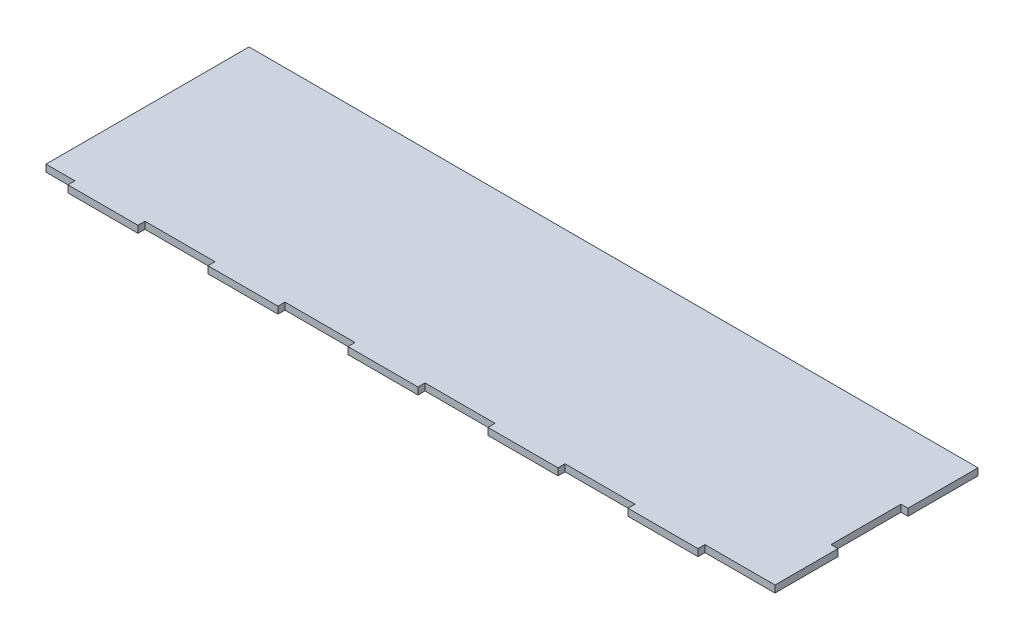
ISO-10303-21;
HEADER;
FILE_DESCRIPTION(('STEP AP214'),'2;1');
FILE_NAME('part.step','',(''),(''),'','','');
FILE_SCHEMA(('AUTOMOTIVE_DESIGN { 1 0 10303 214 1 1 1 1 }'));
ENDSEC;
DATA;
#1=APPLICATION_CONTEXT('core data for automotive mechanical design processes');
#2=APPLICATION_PROTOCOL_DEFINITION('international standard','automotive_design',2000,#1);
#3=PRODUCT_CONTEXT('',#1,'mechanical');
#4=PRODUCT('Part','Part','',(#3));
#5=PRODUCT_RELATED_PRODUCT_CATEGORY('part','',(#4));
#6=PRODUCT_DEFINITION_FORMATION('','',#4);
#7=PRODUCT_DEFINITION_CONTEXT('part definition',#1,'design');
#8=PRODUCT_DEFINITION('design','',#6,#7);
#9=PRODUCT_DEFINITION_SHAPE('','',#8);
#10=(LENGTH_UNIT() NAMED_UNIT(*) SI_UNIT(.MILLI.,.METRE.));
#11=(NAMED_UNIT(*) PLANE_ANGLE_UNIT() SI_UNIT($,.RADIAN.));
#12=(NAMED_UNIT(*) SI_UNIT($,.STERADIAN.) SOLID_ANGLE_UNIT());
#13=UNCERTAINTY_MEASURE_WITH_UNIT(LENGTH_MEASURE(1.E-05),#10,'distance_accuracy_value','');
#14=(GEOMETRIC_REPRESENTATION_CONTEXT(3) GLOBAL_UNCERTAINTY_ASSIGNED_CONTEXT((#13)) GLOBAL_UNIT_ASSIGNED_CONTEXT((#10,
#11,#12)) REPRESENTATION_CONTEXT('',''));
#15=CARTESIAN_POINT('',(0.,0.,0.));
#16=DIRECTION('',(0.,0.,1.));
#17=DIRECTION('',(1.,0.,0.));
#18=AXIS2_PLACEMENT_3D('',#15,#16,#17);
#19=CARTESIAN_POINT('',(2.60000000000005,0.,0.));
#20=DIRECTION('',(-1.,0.,0.));
#21=DIRECTION('',(0.,0.,1.));
#22=AXIS2_PLACEMENT_3D('',#19,#20,#21);
#23=PLANE('',#22);
#24=DIRECTION('',(0.,0.,-1.));
#25=VECTOR('',#24,1.);
#26=CARTESIAN_POINT('',(2.60000000000005,3.,0.));
#27=LINE('',#26,#25);
#28=CARTESIAN_POINT('',(2.60000000000005,3.,42.));
#29=VERTEX_POINT('',#28);
#30=CARTESIAN_POINT('',(2.60000000000005,3.,-45.));
#31=VERTEX_POINT('',#30);
#32=EDGE_CURVE('E238',#29,#31,#27,.T.);
#33=ORIENTED_EDGE('',*,*,#32,.T.);
#34=DIRECTION('',(0.,-1.,0.));
#35=VECTOR('',#34,1.);
#36=CARTESIAN_POINT('',(2.60000000000005,3.,-45.));
#37=LINE('',#36,#35);
#38=CARTESIAN_POINT('',(2.60000000000005,0.,-45.));
#39=VERTEX_POINT('',#38);
#40=EDGE_CURVE('E54',#31,#39,#37,.T.);
#41=ORIENTED_EDGE('',*,*,#40,.T.);
#42=DIRECTION('',(0.,0.,-1.));
#43=VECTOR('',#42,1.);
#44=CARTESIAN_POINT('',(2.60000000000005,0.,0.));
#45=LINE('',#44,#43);
#46=CARTESIAN_POINT('',(2.60000000000005,0.,42.));
#47=VERTEX_POINT('',#46);
#48=EDGE_CURVE('E62',#47,#39,#45,.T.);
#49=ORIENTED_EDGE('',*,*,#48,.F.);
#50=DIRECTION('',(0.,1.,0.));
#51=VECTOR('',#50,1.);
#52=CARTESIAN_POINT('',(2.60000000000005,0.,42.));
#53=LINE('',#52,#51);
#54=EDGE_CURVE('E12',#47,#29,#53,.T.);
#55=ORIENTED_EDGE('',*,*,#54,.T.);
#56=EDGE_LOOP('',(#33,#41,#49,#55));
#57=FACE_BOUND('',#56,.T.);
#58=ADVANCED_FACE('F39',(#57),#23,.T.);
#59=CARTESIAN_POINT('',(-315.,3.,-45.));
#60=DIRECTION('',(0.,0.,1.));
#61=DIRECTION('',(1.,0.,0.));
#62=AXIS2_PLACEMENT_3D('',#59,#60,#61);
#63=PLANE('',#62);
#64=ORIENTED_EDGE('',*,*,#40,.F.);
#65=DIRECTION('',(-1.,0.,0.));
#66=VECTOR('',#65,1.);
#67=CARTESIAN_POINT('',(-315.,3.,-45.));
#68=LINE('',#67,#66);
#69=CARTESIAN_POINT('',(315.,3.,-45.));
#70=VERTEX_POINT('',#69);
#71=EDGE_CURVE('E240',#70,#31,#68,.T.);
#72=ORIENTED_EDGE('',*,*,#71,.F.);
#73=DIRECTION('',(0.,-1.,0.));
#74=VECTOR('',#73,1.);
#75=CARTESIAN_POINT('',(315.,3.,-45.));
#76=LINE('',#75,#74);
#77=CARTESIAN_POINT('',(315.,0.,-45.));
#78=VERTEX_POINT('',#77);
#79=EDGE_CURVE('E414',#70,#78,#76,.T.);
#80=ORIENTED_EDGE('',*,*,#79,.T.);
#81=DIRECTION('',(-1.,0.,0.));
#82=VECTOR('',#81,1.);
#83=CARTESIAN_POINT('',(-315.,0.,-45.));
#84=LINE('',#83,#82);
#85=EDGE_CURVE('E407',#78,#39,#84,.T.);
#86=ORIENTED_EDGE('',*,*,#85,.T.);
#87=EDGE_LOOP('',(#64,#72,#80,#86));
#88=FACE_BOUND('',#87,.T.);
#89=ADVANCED_FACE('F488',(#88),#63,.F.);
#90=CARTESIAN_POINT('',(0.,3.,0.));
#91=DIRECTION('',(0.,-1.,0.));
#92=DIRECTION('',(0.,0.,-1.));
#93=AXIS2_PLACEMENT_3D('',#90,#91,#92);
#94=PLANE('',#93);
#95=ORIENTED_EDGE('',*,*,#32,.F.);
#96=DIRECTION('',(-1.,0.,0.));
#97=VECTOR('',#96,1.);
#98=CARTESIAN_POINT('',(-15.,3.,42.));
#99=LINE('',#98,#97);
#100=CARTESIAN_POINT('',(15.,3.,42.));
#101=VERTEX_POINT('',#100);
#102=EDGE_CURVE('E226',#101,#29,#99,.T.);
#103=ORIENTED_EDGE('',*,*,#102,.F.);
#104=DIRECTION('',(0.,0.,-1.));
#105=VECTOR('',#104,1.);
#106=CARTESIAN_POINT('',(15.,3.,45.));
#107=LINE('',#106,#105);
#108=CARTESIAN_POINT('',(15.,3.,45.));
#109=VERTEX_POINT('',#108);
#110=EDGE_CURVE('E235',#109,#101,#107,.T.);
#111=ORIENTED_EDGE('',*,*,#110,.F.);
#112=DIRECTION('',(1.,0.,0.));
#113=VECTOR('',#112,1.);
#114=CARTESIAN_POINT('',(-315.,3.,45.));
#115=LINE('',#114,#113);
#116=CARTESIAN_POINT('',(45.,3.,45.));
#117=VERTEX_POINT('',#116);
#118=EDGE_CURVE('E403',#109,#117,#115,.T.);
#119=ORIENTED_EDGE('',*,*,#118,.T.);
#120=DIRECTION('',(0.,0.,1.));
#121=VECTOR('',#120,1.);
#122=CARTESIAN_POINT('',(45.,3.,45.));
#123=LINE('',#122,#121);
#124=CARTESIAN_POINT('',(45.,3.,42.));
#125=VERTEX_POINT('',#124);
#126=EDGE_CURVE('E285',#125,#117,#123,.T.);
#127=ORIENTED_EDGE('',*,*,#126,.F.);
#128=DIRECTION('',(-1.,0.,0.));
#129=VECTOR('',#128,1.);
#130=CARTESIAN_POINT('',(45.,3.,42.));
#131=LINE('',#130,#129);
#132=CARTESIAN_POINT('',(75.,3.,42.));
#133=VERTEX_POINT('',#132);
#134=EDGE_CURVE('E278',#133,#125,#131,.T.);
#135=ORIENTED_EDGE('',*,*,#134,.F.);
#136=DIRECTION('',(0.,0.,-1.));
#137=VECTOR('',#136,1.);
#138=CARTESIAN_POINT('',(75.,3.,45.));
#139=LINE('',#138,#137);
#140=CARTESIAN_POINT('',(75.,3.,45.));
#141=VERTEX_POINT('',#140);
#142=EDGE_CURVE('E287',#141,#133,#139,.T.);
#143=ORIENTED_EDGE('',*,*,#142,.F.);
#144=CARTESIAN_POINT('',(105.,3.,45.));
#145=VERTEX_POINT('',#144);
#146=EDGE_CURVE('E754',#141,#145,#115,.T.);
#147=ORIENTED_EDGE('',*,*,#146,.T.);
#148=DIRECTION('',(0.,0.,1.));
#149=VECTOR('',#148,1.);
#150=CARTESIAN_POINT('',(105.,3.,45.));
#151=LINE('',#150,#149);
#152=CARTESIAN_POINT('',(105.,3.,42.));
#153=VERTEX_POINT('',#152);
#154=EDGE_CURVE('E311',#153,#145,#151,.T.);
#155=ORIENTED_EDGE('',*,*,#154,.F.);
#156=DIRECTION('',(-1.,0.,0.));
#157=VECTOR('',#156,1.);
#158=CARTESIAN_POINT('',(105.,3.,42.));
#159=LINE('',#158,#157);
#160=CARTESIAN_POINT('',(135.,3.,42.));
#161=VERTEX_POINT('',#160);
#162=EDGE_CURVE('E304',#161,#153,#159,.T.);
#163=ORIENTED_EDGE('',*,*,#162,.F.);
#164=DIRECTION('',(0.,0.,-1.));
#165=VECTOR('',#164,1.);
#166=CARTESIAN_POINT('',(135.,3.,45.));
#167=LINE('',#166,#165);
#168=CARTESIAN_POINT('',(135.,3.,45.));
#169=VERTEX_POINT('',#168);
#170=EDGE_CURVE('E313',#169,#161,#167,.T.);
#171=ORIENTED_EDGE('',*,*,#170,.F.);
#172=CARTESIAN_POINT('',(165.,3.,45.));
#173=VERTEX_POINT('',#172);
#174=EDGE_CURVE('E751',#169,#173,#115,.T.);
#175=ORIENTED_EDGE('',*,*,#174,.T.);
#176=DIRECTION('',(0.,0.,1.));
#177=VECTOR('',#176,1.);
#178=CARTESIAN_POINT('',(165.,3.,45.));
#179=LINE('',#178,#177);
#180=CARTESIAN_POINT('',(165.,3.,42.));
#181=VERTEX_POINT('',#180);
#182=EDGE_CURVE('E337',#181,#173,#179,.T.);
#183=ORIENTED_EDGE('',*,*,#182,.F.);
#184=DIRECTION('',(-1.,0.,0.));
#185=VECTOR('',#184,1.);
#186=CARTESIAN_POINT('',(165.,3.,42.));
#187=LINE('',#186,#185);
#188=CARTESIAN_POINT('',(195.,3.,42.));
#189=VERTEX_POINT('',#188);
#190=EDGE_CURVE('E330',#189,#181,#187,.T.);
#191=ORIENTED_EDGE('',*,*,#190,.F.);
#192=DIRECTION('',(0.,0.,-1.));
#193=VECTOR('',#192,1.);
#194=CARTESIAN_POINT('',(195.,3.,45.));
#195=LINE('',#194,#193);
#196=CARTESIAN_POINT('',(195.,3.,45.));
#197=VERTEX_POINT('',#196);
#198=EDGE_CURVE('E339',#197,#189,#195,.T.);
#199=ORIENTED_EDGE('',*,*,#198,.F.);
#200=CARTESIAN_POINT('',(225.,3.,45.));
#201=VERTEX_POINT('',#200);
#202=EDGE_CURVE('E402',#197,#201,#115,.T.);
#203=ORIENTED_EDGE('',*,*,#202,.T.);
#204=DIRECTION('',(0.,0.,1.));
#205=VECTOR('',#204,1.);
#206=CARTESIAN_POINT('',(225.,3.,45.));
#207=LINE('',#206,#205);
#208=CARTESIAN_POINT('',(225.,3.,42.));
#209=VERTEX_POINT('',#208);
#210=EDGE_CURVE('E363',#209,#201,#207,.T.);
#211=ORIENTED_EDGE('',*,*,#210,.F.);
#212=DIRECTION('',(-1.,0.,0.));
#213=VECTOR('',#212,1.);
#214=CARTESIAN_POINT('',(225.,3.,42.));
#215=LINE('',#214,#213);
#216=CARTESIAN_POINT('',(255.,3.,42.));
#217=VERTEX_POINT('',#216);
#218=EDGE_CURVE('E356',#217,#209,#215,.T.);
#219=ORIENTED_EDGE('',*,*,#218,.F.);
#220=DIRECTION('',(0.,0.,-1.));
#221=VECTOR('',#220,1.);
#222=CARTESIAN_POINT('',(255.,3.,45.));
#223=LINE('',#222,#221);
#224=CARTESIAN_POINT('',(255.,3.,45.));
#225=VERTEX_POINT('',#224);
#226=EDGE_CURVE('E365',#225,#217,#223,.T.);
#227=ORIENTED_EDGE('',*,*,#226,.F.);
#228=CARTESIAN_POINT('',(285.,3.,45.));
#229=VERTEX_POINT('',#228);
#230=EDGE_CURVE('E399',#225,#229,#115,.T.);
#231=ORIENTED_EDGE('',*,*,#230,.T.);
#232=DIRECTION('',(0.,0.,1.));
#233=VECTOR('',#232,1.);
#234=CARTESIAN_POINT('',(285.,3.,45.));
#235=LINE('',#234,#233);
#236=CARTESIAN_POINT('',(285.,3.,42.));
#237=VERTEX_POINT('',#236);
#238=EDGE_CURVE('E261',#237,#229,#235,.T.);
#239=ORIENTED_EDGE('',*,*,#238,.F.);
#240=DIRECTION('',(-1.,0.,0.));
#241=VECTOR('',#240,1.);
#242=CARTESIAN_POINT('',(285.,3.,42.));
#243=LINE('',#242,#241);
#244=CARTESIAN_POINT('',(315.,3.,42.));
#245=VERTEX_POINT('',#244);
#246=EDGE_CURVE('E382',#245,#237,#243,.T.);
#247=ORIENTED_EDGE('',*,*,#246,.F.);
#248=DIRECTION('',(0.,0.,-1.));
#249=VECTOR('',#248,1.);
#250=CARTESIAN_POINT('',(315.,3.,45.));
#251=LINE('',#250,#249);
#252=CARTESIAN_POINT('',(315.,3.,14.9999999985429));
#253=VERTEX_POINT('',#252);
#254=EDGE_CURVE('E394',#245,#253,#251,.T.);
#255=ORIENTED_EDGE('',*,*,#254,.T.);
#256=DIRECTION('',(-1.,0.,0.));
#257=VECTOR('',#256,1.);
#258=CARTESIAN_POINT('',(312.,3.,14.9999999985429));
#259=LINE('',#258,#257);
#260=CARTESIAN_POINT('',(312.,3.,14.9999999985429));
#261=VERTEX_POINT('',#260);
#262=EDGE_CURVE('E247',#253,#261,#259,.T.);
#263=ORIENTED_EDGE('',*,*,#262,.T.);
#264=DIRECTION('',(0.,0.,-1.));
#265=VECTOR('',#264,1.);
#266=CARTESIAN_POINT('',(312.,3.,14.9999999985429));
#267=LINE('',#266,#265);
#268=CARTESIAN_POINT('',(312.,3.,-15.0000000014571));
#269=VERTEX_POINT('',#268);
#270=EDGE_CURVE('E250',#261,#269,#267,.T.);
#271=ORIENTED_EDGE('',*,*,#270,.T.);
#272=DIRECTION('',(1.,0.,0.));
#273=VECTOR('',#272,1.);
#274=CARTESIAN_POINT('',(312.,3.,-15.0000000014571));
#275=LINE('',#274,#273);
#276=CARTESIAN_POINT('',(315.,3.,-15.0000000014571));
#277=VERTEX_POINT('',#276);
#278=EDGE_CURVE('E253',#269,#277,#275,.T.);
#279=ORIENTED_EDGE('',*,*,#278,.T.);
#280=EDGE_CURVE('E397',#277,#70,#251,.T.);
#281=ORIENTED_EDGE('',*,*,#280,.T.);
#282=ORIENTED_EDGE('',*,*,#71,.T.);
#283=EDGE_LOOP('',(#95,#103,#111,#119,#127,#135,#143,#147,#155,#163,#171,#175,#183,#191,#199,
#203,#211,#219,#227,#231,#239,#247,#255,#263,#271,#279,#281,#282));
#284=FACE_BOUND('',#283,.T.);
#285=ADVANCED_FACE('F239',(#284),#94,.F.);
#286=CARTESIAN_POINT('',(0.,0.,0.));
#287=DIRECTION('',(0.,-1.,0.));
#288=DIRECTION('',(0.,0.,-1.));
#289=AXIS2_PLACEMENT_3D('',#286,#287,#288);
#290=PLANE('',#289);
#291=DIRECTION('',(-1.,0.,0.));
#292=VECTOR('',#291,1.);
#293=CARTESIAN_POINT('',(-15.,0.,42.));
#294=LINE('',#293,#292);
#295=CARTESIAN_POINT('',(15.,0.,42.));
#296=VERTEX_POINT('',#295);
#297=EDGE_CURVE('E266',#296,#47,#294,.T.);
#298=ORIENTED_EDGE('',*,*,#297,.T.);
#299=ORIENTED_EDGE('',*,*,#48,.T.);
#300=ORIENTED_EDGE('',*,*,#85,.F.);
#301=DIRECTION('',(0.,0.,-1.));
#302=VECTOR('',#301,1.);
#303=CARTESIAN_POINT('',(315.,0.,45.));
#304=LINE('',#303,#302);
#305=CARTESIAN_POINT('',(315.,0.,-15.0000000014571));
#306=VERTEX_POINT('',#305);
#307=EDGE_CURVE('E272',#306,#78,#304,.T.);
#308=ORIENTED_EDGE('',*,*,#307,.F.);
#309=DIRECTION('',(1.,0.,0.));
#310=VECTOR('',#309,1.);
#311=CARTESIAN_POINT('',(0.,0.,-15.0000000014569));
#312=LINE('',#311,#310);
#313=CARTESIAN_POINT('',(312.,0.,-15.0000000014571));
#314=VERTEX_POINT('',#313);
#315=EDGE_CURVE('E47',#314,#306,#312,.T.);
#316=ORIENTED_EDGE('',*,*,#315,.F.);
#317=DIRECTION('',(0.,0.,-1.));
#318=VECTOR('',#317,1.);
#319=CARTESIAN_POINT('',(312.,0.,0.));
#320=LINE('',#319,#318);
#321=CARTESIAN_POINT('',(312.,0.,14.9999999985429));
#322=VERTEX_POINT('',#321);
#323=EDGE_CURVE('E420',#322,#314,#320,.T.);
#324=ORIENTED_EDGE('',*,*,#323,.F.);
#325=DIRECTION('',(-1.,0.,0.));
#326=VECTOR('',#325,1.);
#327=CARTESIAN_POINT('',(0.,0.,14.9999999985429));
#328=LINE('',#327,#326);
#329=CARTESIAN_POINT('',(315.,0.,14.9999999985429));
#330=VERTEX_POINT('',#329);
#331=EDGE_CURVE('E417',#330,#322,#328,.T.);
#332=ORIENTED_EDGE('',*,*,#331,.F.);
#333=CARTESIAN_POINT('',(315.,0.,42.));
#334=VERTEX_POINT('',#333);
#335=EDGE_CURVE('E404',#334,#330,#304,.T.);
#336=ORIENTED_EDGE('',*,*,#335,.F.);
#337=DIRECTION('',(-1.,0.,0.));
#338=VECTOR('',#337,1.);
#339=CARTESIAN_POINT('',(285.,0.,42.));
#340=LINE('',#339,#338);
#341=CARTESIAN_POINT('',(285.,0.,42.));
#342=VERTEX_POINT('',#341);
#343=EDGE_CURVE('E381',#334,#342,#340,.T.);
#344=ORIENTED_EDGE('',*,*,#343,.T.);
#345=DIRECTION('',(0.,0.,1.));
#346=VECTOR('',#345,1.);
#347=CARTESIAN_POINT('',(285.,0.,45.));
#348=LINE('',#347,#346);
#349=CARTESIAN_POINT('',(285.,0.,45.));
#350=VERTEX_POINT('',#349);
#351=EDGE_CURVE('E378',#342,#350,#348,.T.);
#352=ORIENTED_EDGE('',*,*,#351,.T.);
#353=DIRECTION('',(1.,0.,0.));
#354=VECTOR('',#353,1.);
#355=CARTESIAN_POINT('',(-315.,0.,45.));
#356=LINE('',#355,#354);
#357=CARTESIAN_POINT('',(255.,0.,45.));
#358=VERTEX_POINT('',#357);
#359=EDGE_CURVE('E409',#358,#350,#356,.T.);
#360=ORIENTED_EDGE('',*,*,#359,.F.);
#361=DIRECTION('',(0.,0.,-1.));
#362=VECTOR('',#361,1.);
#363=CARTESIAN_POINT('',(255.,0.,45.));
#364=LINE('',#363,#362);
#365=CARTESIAN_POINT('',(255.,0.,42.));
#366=VERTEX_POINT('',#365);
#367=EDGE_CURVE('E355',#358,#366,#364,.T.);
#368=ORIENTED_EDGE('',*,*,#367,.T.);
#369=DIRECTION('',(-1.,0.,0.));
#370=VECTOR('',#369,1.);
#371=CARTESIAN_POINT('',(225.,0.,42.));
#372=LINE('',#371,#370);
#373=CARTESIAN_POINT('',(225.,0.,42.));
#374=VERTEX_POINT('',#373);
#375=EDGE_CURVE('E359',#366,#374,#372,.T.);
#376=ORIENTED_EDGE('',*,*,#375,.T.);
#377=DIRECTION('',(0.,0.,1.));
#378=VECTOR('',#377,1.);
#379=CARTESIAN_POINT('',(225.,0.,45.));
#380=LINE('',#379,#378);
#381=CARTESIAN_POINT('',(225.,0.,45.));
#382=VERTEX_POINT('',#381);
#383=EDGE_CURVE('E352',#374,#382,#380,.T.);
#384=ORIENTED_EDGE('',*,*,#383,.T.);
#385=CARTESIAN_POINT('',(195.,0.,45.));
#386=VERTEX_POINT('',#385);
#387=EDGE_CURVE('E412',#386,#382,#356,.T.);
#388=ORIENTED_EDGE('',*,*,#387,.F.);
#389=DIRECTION('',(0.,0.,-1.));
#390=VECTOR('',#389,1.);
#391=CARTESIAN_POINT('',(195.,0.,45.));
#392=LINE('',#391,#390);
#393=CARTESIAN_POINT('',(195.,0.,42.));
#394=VERTEX_POINT('',#393);
#395=EDGE_CURVE('E329',#386,#394,#392,.T.);
#396=ORIENTED_EDGE('',*,*,#395,.T.);
#397=DIRECTION('',(-1.,0.,0.));
#398=VECTOR('',#397,1.);
#399=CARTESIAN_POINT('',(165.,0.,42.));
#400=LINE('',#399,#398);
#401=CARTESIAN_POINT('',(165.,0.,42.));
#402=VERTEX_POINT('',#401);
#403=EDGE_CURVE('E333',#394,#402,#400,.T.);
#404=ORIENTED_EDGE('',*,*,#403,.T.);
#405=DIRECTION('',(0.,0.,1.));
#406=VECTOR('',#405,1.);
#407=CARTESIAN_POINT('',(165.,0.,45.));
#408=LINE('',#407,#406);
#409=CARTESIAN_POINT('',(165.,0.,45.));
#410=VERTEX_POINT('',#409);
#411=EDGE_CURVE('E326',#402,#410,#408,.T.);
#412=ORIENTED_EDGE('',*,*,#411,.T.);
#413=CARTESIAN_POINT('',(135.,0.,45.));
#414=VERTEX_POINT('',#413);
#415=EDGE_CURVE('E471',#414,#410,#356,.T.);
#416=ORIENTED_EDGE('',*,*,#415,.F.);
#417=DIRECTION('',(0.,0.,-1.));
#418=VECTOR('',#417,1.);
#419=CARTESIAN_POINT('',(135.,0.,45.));
#420=LINE('',#419,#418);
#421=CARTESIAN_POINT('',(135.,0.,42.));
#422=VERTEX_POINT('',#421);
#423=EDGE_CURVE('E303',#414,#422,#420,.T.);
#424=ORIENTED_EDGE('',*,*,#423,.T.);
#425=DIRECTION('',(-1.,0.,0.));
#426=VECTOR('',#425,1.);
#427=CARTESIAN_POINT('',(105.,0.,42.));
#428=LINE('',#427,#426);
#429=CARTESIAN_POINT('',(105.,0.,42.));
#430=VERTEX_POINT('',#429);
#431=EDGE_CURVE('E307',#422,#430,#428,.T.);
#432=ORIENTED_EDGE('',*,*,#431,.T.);
#433=DIRECTION('',(0.,0.,1.));
#434=VECTOR('',#433,1.);
#435=CARTESIAN_POINT('',(105.,0.,45.));
#436=LINE('',#435,#434);
#437=CARTESIAN_POINT('',(105.,0.,45.));
#438=VERTEX_POINT('',#437);
#439=EDGE_CURVE('E300',#430,#438,#436,.T.);
#440=ORIENTED_EDGE('',*,*,#439,.T.);
#441=CARTESIAN_POINT('',(75.,0.,45.));
#442=VERTEX_POINT('',#441);
#443=EDGE_CURVE('E473',#442,#438,#356,.T.);
#444=ORIENTED_EDGE('',*,*,#443,.F.);
#445=DIRECTION('',(0.,0.,-1.));
#446=VECTOR('',#445,1.);
#447=CARTESIAN_POINT('',(75.,0.,45.));
#448=LINE('',#447,#446);
#449=CARTESIAN_POINT('',(75.,0.,42.));
#450=VERTEX_POINT('',#449);
#451=EDGE_CURVE('E277',#442,#450,#448,.T.);
#452=ORIENTED_EDGE('',*,*,#451,.T.);
#453=DIRECTION('',(-1.,0.,0.));
#454=VECTOR('',#453,1.);
#455=CARTESIAN_POINT('',(45.,0.,42.));
#456=LINE('',#455,#454);
#457=CARTESIAN_POINT('',(45.,0.,42.));
#458=VERTEX_POINT('',#457);
#459=EDGE_CURVE('E281',#450,#458,#456,.T.);
#460=ORIENTED_EDGE('',*,*,#459,.T.);
#461=DIRECTION('',(0.,0.,1.));
#462=VECTOR('',#461,1.);
#463=CARTESIAN_POINT('',(45.,0.,45.));
#464=LINE('',#463,#462);
#465=CARTESIAN_POINT('',(45.,0.,45.));
#466=VERTEX_POINT('',#465);
#467=EDGE_CURVE('E274',#458,#466,#464,.T.);
#468=ORIENTED_EDGE('',*,*,#467,.T.);
#469=CARTESIAN_POINT('',(15.,0.,45.));
#470=VERTEX_POINT('',#469);
#471=EDGE_CURVE('E413',#470,#466,#356,.T.);
#472=ORIENTED_EDGE('',*,*,#471,.F.);
#473=DIRECTION('',(0.,0.,-1.));
#474=VECTOR('',#473,1.);
#475=CARTESIAN_POINT('',(15.,0.,45.));
#476=LINE('',#475,#474);
#477=EDGE_CURVE('E234',#470,#296,#476,.T.);
#478=ORIENTED_EDGE('',*,*,#477,.T.);
#479=EDGE_LOOP('',(#298,#299,#300,#308,#316,#324,#332,#336,#344,#352,#360,#368,#376,#384,#388,
#396,#404,#412,#416,#424,#432,#440,#444,#452,#460,#468,#472,#478));
#480=FACE_BOUND('',#479,.T.);
#481=ADVANCED_FACE('F429',(#480),#290,.T.);
#482=CARTESIAN_POINT('',(-15.,0.,42.));
#483=DIRECTION('',(0.,0.,-1.));
#484=DIRECTION('',(-1.,0.,0.));
#485=AXIS2_PLACEMENT_3D('',#482,#483,#484);
#486=PLANE('',#485);
#487=ORIENTED_EDGE('',*,*,#54,.F.);
#488=ORIENTED_EDGE('',*,*,#297,.F.);
#489=DIRECTION('',(0.,1.,0.));
#490=VECTOR('',#489,1.);
#491=CARTESIAN_POINT('',(15.,0.,42.));
#492=LINE('',#491,#490);
#493=EDGE_CURVE('E230',#296,#101,#492,.T.);
#494=ORIENTED_EDGE('',*,*,#493,.T.);
#495=ORIENTED_EDGE('',*,*,#102,.T.);
#496=EDGE_LOOP('',(#487,#488,#494,#495));
#497=FACE_BOUND('',#496,.T.);
#498=ADVANCED_FACE('F228',(#497),#486,.F.);
#499=CARTESIAN_POINT('',(315.,3.,45.));
#500=DIRECTION('',(-1.,0.,0.));
#501=DIRECTION('',(0.,0.,1.));
#502=AXIS2_PLACEMENT_3D('',#499,#500,#501);
#503=PLANE('',#502);
#504=ORIENTED_EDGE('',*,*,#280,.F.);
#505=DIRECTION('',(0.,-1.,0.));
#506=VECTOR('',#505,1.);
#507=CARTESIAN_POINT('',(315.,3.,-15.0000000014571));
#508=LINE('',#507,#506);
#509=EDGE_CURVE('E255',#277,#306,#508,.T.);
#510=ORIENTED_EDGE('',*,*,#509,.T.);
#511=ORIENTED_EDGE('',*,*,#307,.T.);
#512=ORIENTED_EDGE('',*,*,#79,.F.);
#513=EDGE_LOOP('',(#504,#510,#511,#512));
#514=FACE_BOUND('',#513,.T.);
#515=ADVANCED_FACE('F489',(#514),#503,.F.);
#516=CARTESIAN_POINT('',(-315.,3.,45.));
#517=DIRECTION('',(0.,0.,-1.));
#518=DIRECTION('',(-1.,0.,0.));
#519=AXIS2_PLACEMENT_3D('',#516,#517,#518);
#520=PLANE('',#519);
#521=ORIENTED_EDGE('',*,*,#387,.T.);
#522=DIRECTION('',(0.,1.,0.));
#523=VECTOR('',#522,1.);
#524=CARTESIAN_POINT('',(225.,0.,45.));
#525=LINE('',#524,#523);
#526=EDGE_CURVE('E362',#382,#201,#525,.T.);
#527=ORIENTED_EDGE('',*,*,#526,.T.);
#528=ORIENTED_EDGE('',*,*,#202,.F.);
#529=DIRECTION('',(0.,1.,0.));
#530=VECTOR('',#529,1.);
#531=CARTESIAN_POINT('',(195.,0.,45.));
#532=LINE('',#531,#530);
#533=EDGE_CURVE('E348',#386,#197,#532,.T.);
#534=ORIENTED_EDGE('',*,*,#533,.F.);
#535=EDGE_LOOP('',(#521,#527,#528,#534));
#536=FACE_BOUND('',#535,.T.);
#537=ADVANCED_FACE('F468',(#536),#520,.F.);
#538=ORIENTED_EDGE('',*,*,#415,.T.);
#539=DIRECTION('',(0.,1.,0.));
#540=VECTOR('',#539,1.);
#541=CARTESIAN_POINT('',(165.,0.,45.));
#542=LINE('',#541,#540);
#543=EDGE_CURVE('E336',#410,#173,#542,.T.);
#544=ORIENTED_EDGE('',*,*,#543,.T.);
#545=ORIENTED_EDGE('',*,*,#174,.F.);
#546=DIRECTION('',(0.,1.,0.));
#547=VECTOR('',#546,1.);
#548=CARTESIAN_POINT('',(135.,0.,45.));
#549=LINE('',#548,#547);
#550=EDGE_CURVE('E322',#414,#169,#549,.T.);
#551=ORIENTED_EDGE('',*,*,#550,.F.);
#552=EDGE_LOOP('',(#538,#544,#545,#551));
#553=FACE_BOUND('',#552,.T.);
#554=ADVANCED_FACE('F495',(#553),#520,.F.);
#555=ORIENTED_EDGE('',*,*,#443,.T.);
#556=DIRECTION('',(0.,1.,0.));
#557=VECTOR('',#556,1.);
#558=CARTESIAN_POINT('',(105.,0.,45.));
#559=LINE('',#558,#557);
#560=EDGE_CURVE('E310',#438,#145,#559,.T.);
#561=ORIENTED_EDGE('',*,*,#560,.T.);
#562=ORIENTED_EDGE('',*,*,#146,.F.);
#563=DIRECTION('',(0.,1.,0.));
#564=VECTOR('',#563,1.);
#565=CARTESIAN_POINT('',(75.,0.,45.));
#566=LINE('',#565,#564);
#567=EDGE_CURVE('E296',#442,#141,#566,.T.);
#568=ORIENTED_EDGE('',*,*,#567,.F.);
#569=EDGE_LOOP('',(#555,#561,#562,#568));
#570=FACE_BOUND('',#569,.T.);
#571=ADVANCED_FACE('F569',(#570),#520,.F.);
#572=ORIENTED_EDGE('',*,*,#471,.T.);
#573=DIRECTION('',(0.,1.,0.));
#574=VECTOR('',#573,1.);
#575=CARTESIAN_POINT('',(45.,0.,45.));
#576=LINE('',#575,#574);
#577=EDGE_CURVE('E284',#466,#117,#576,.T.);
#578=ORIENTED_EDGE('',*,*,#577,.T.);
#579=ORIENTED_EDGE('',*,*,#118,.F.);
#580=DIRECTION('',(0.,1.,0.));
#581=VECTOR('',#580,1.);
#582=CARTESIAN_POINT('',(15.,0.,45.));
#583=LINE('',#582,#581);
#584=EDGE_CURVE('E268',#470,#109,#583,.T.);
#585=ORIENTED_EDGE('',*,*,#584,.F.);
#586=EDGE_LOOP('',(#572,#578,#579,#585));
#587=FACE_BOUND('',#586,.T.);
#588=ADVANCED_FACE('F499',(#587),#520,.F.);
#589=ORIENTED_EDGE('',*,*,#335,.T.);
#590=DIRECTION('',(0.,-1.,0.));
#591=VECTOR('',#590,1.);
#592=CARTESIAN_POINT('',(315.,3.,14.9999999985429));
#593=LINE('',#592,#591);
#594=EDGE_CURVE('E246',#253,#330,#593,.T.);
#595=ORIENTED_EDGE('',*,*,#594,.F.);
#596=ORIENTED_EDGE('',*,*,#254,.F.);
#597=DIRECTION('',(0.,1.,0.));
#598=VECTOR('',#597,1.);
#599=CARTESIAN_POINT('',(315.,0.,42.));
#600=LINE('',#599,#598);
#601=EDGE_CURVE('E390',#334,#245,#600,.T.);
#602=ORIENTED_EDGE('',*,*,#601,.F.);
#603=EDGE_LOOP('',(#589,#595,#596,#602));
#604=FACE_BOUND('',#603,.T.);
#605=ADVANCED_FACE('F41',(#604),#503,.F.);
#606=ORIENTED_EDGE('',*,*,#359,.T.);
#607=DIRECTION('',(0.,1.,0.));
#608=VECTOR('',#607,1.);
#609=CARTESIAN_POINT('',(285.,0.,45.));
#610=LINE('',#609,#608);
#611=EDGE_CURVE('E385',#350,#229,#610,.T.);
#612=ORIENTED_EDGE('',*,*,#611,.T.);
#613=ORIENTED_EDGE('',*,*,#230,.F.);
#614=DIRECTION('',(0.,1.,0.));
#615=VECTOR('',#614,1.);
#616=CARTESIAN_POINT('',(255.,0.,45.));
#617=LINE('',#616,#615);
#618=EDGE_CURVE('E374',#358,#225,#617,.T.);
#619=ORIENTED_EDGE('',*,*,#618,.F.);
#620=EDGE_LOOP('',(#606,#612,#613,#619));
#621=FACE_BOUND('',#620,.T.);
#622=ADVANCED_FACE('F451',(#621),#520,.F.);
#623=CARTESIAN_POINT('',(15.,0.,45.));
#624=DIRECTION('',(1.,0.,0.));
#625=DIRECTION('',(0.,0.,-1.));
#626=AXIS2_PLACEMENT_3D('',#623,#624,#625);
#627=PLANE('',#626);
#628=ORIENTED_EDGE('',*,*,#110,.T.);
#629=ORIENTED_EDGE('',*,*,#493,.F.);
#630=ORIENTED_EDGE('',*,*,#477,.F.);
#631=ORIENTED_EDGE('',*,*,#584,.T.);
#632=EDGE_LOOP('',(#628,#629,#630,#631));
#633=FACE_BOUND('',#632,.T.);
#634=ADVANCED_FACE('F512',(#633),#627,.F.);
#635=CARTESIAN_POINT('',(45.,0.,45.));
#636=DIRECTION('',(-1.,0.,0.));
#637=DIRECTION('',(0.,0.,1.));
#638=AXIS2_PLACEMENT_3D('',#635,#636,#637);
#639=PLANE('',#638);
#640=ORIENTED_EDGE('',*,*,#126,.T.);
#641=ORIENTED_EDGE('',*,*,#577,.F.);
#642=ORIENTED_EDGE('',*,*,#467,.F.);
#643=DIRECTION('',(0.,1.,0.));
#644=VECTOR('',#643,1.);
#645=CARTESIAN_POINT('',(45.,0.,42.));
#646=LINE('',#645,#644);
#647=EDGE_CURVE('E269',#458,#125,#646,.T.);
#648=ORIENTED_EDGE('',*,*,#647,.T.);
#649=EDGE_LOOP('',(#640,#641,#642,#648));
#650=FACE_BOUND('',#649,.T.);
#651=ADVANCED_FACE('F515',(#650),#639,.F.);
#652=CARTESIAN_POINT('',(45.,0.,42.));
#653=DIRECTION('',(0.,0.,-1.));
#654=DIRECTION('',(-1.,0.,0.));
#655=AXIS2_PLACEMENT_3D('',#652,#653,#654);
#656=PLANE('',#655);
#657=ORIENTED_EDGE('',*,*,#134,.T.);
#658=ORIENTED_EDGE('',*,*,#647,.F.);
#659=ORIENTED_EDGE('',*,*,#459,.F.);
#660=DIRECTION('',(0.,1.,0.));
#661=VECTOR('',#660,1.);
#662=CARTESIAN_POINT('',(75.,0.,42.));
#663=LINE('',#662,#661);
#664=EDGE_CURVE('E294',#450,#133,#663,.T.);
#665=ORIENTED_EDGE('',*,*,#664,.T.);
#666=EDGE_LOOP('',(#657,#658,#659,#665));
#667=FACE_BOUND('',#666,.T.);
#668=ADVANCED_FACE('F517',(#667),#656,.F.);
#669=CARTESIAN_POINT('',(75.,0.,45.));
#670=DIRECTION('',(1.,0.,0.));
#671=DIRECTION('',(0.,0.,-1.));
#672=AXIS2_PLACEMENT_3D('',#669,#670,#671);
#673=PLANE('',#672);
#674=ORIENTED_EDGE('',*,*,#142,.T.);
#675=ORIENTED_EDGE('',*,*,#664,.F.);
#676=ORIENTED_EDGE('',*,*,#451,.F.);
#677=ORIENTED_EDGE('',*,*,#567,.T.);
#678=EDGE_LOOP('',(#674,#675,#676,#677));
#679=FACE_BOUND('',#678,.T.);
#680=ADVANCED_FACE('F520',(#679),#673,.F.);
#681=CARTESIAN_POINT('',(105.,0.,45.));
#682=DIRECTION('',(-1.,0.,0.));
#683=DIRECTION('',(0.,0.,1.));
#684=AXIS2_PLACEMENT_3D('',#681,#682,#683);
#685=PLANE('',#684);
#686=ORIENTED_EDGE('',*,*,#154,.T.);
#687=ORIENTED_EDGE('',*,*,#560,.F.);
#688=ORIENTED_EDGE('',*,*,#439,.F.);
#689=DIRECTION('',(0.,1.,0.));
#690=VECTOR('',#689,1.);
#691=CARTESIAN_POINT('',(105.,0.,42.));
#692=LINE('',#691,#690);
#693=EDGE_CURVE('E288',#430,#153,#692,.T.);
#694=ORIENTED_EDGE('',*,*,#693,.T.);
#695=EDGE_LOOP('',(#686,#687,#688,#694));
#696=FACE_BOUND('',#695,.T.);
#697=ADVANCED_FACE('F524',(#696),#685,.F.);
#698=CARTESIAN_POINT('',(105.,0.,42.));
#699=DIRECTION('',(0.,0.,-1.));
#700=DIRECTION('',(-1.,0.,0.));
#701=AXIS2_PLACEMENT_3D('',#698,#699,#700);
#702=PLANE('',#701);
#703=ORIENTED_EDGE('',*,*,#162,.T.);
#704=ORIENTED_EDGE('',*,*,#693,.F.);
#705=ORIENTED_EDGE('',*,*,#431,.F.);
#706=DIRECTION('',(0.,1.,0.));
#707=VECTOR('',#706,1.);
#708=CARTESIAN_POINT('',(135.,0.,42.));
#709=LINE('',#708,#707);
#710=EDGE_CURVE('E320',#422,#161,#709,.T.);
#711=ORIENTED_EDGE('',*,*,#710,.T.);
#712=EDGE_LOOP('',(#703,#704,#705,#711));
#713=FACE_BOUND('',#712,.T.);
#714=ADVANCED_FACE('F529',(#713),#702,.F.);
#715=CARTESIAN_POINT('',(135.,0.,45.));
#716=DIRECTION('',(1.,0.,0.));
#717=DIRECTION('',(0.,0.,-1.));
#718=AXIS2_PLACEMENT_3D('',#715,#716,#717);
#719=PLANE('',#718);
#720=ORIENTED_EDGE('',*,*,#170,.T.);
#721=ORIENTED_EDGE('',*,*,#710,.F.);
#722=ORIENTED_EDGE('',*,*,#423,.F.);
#723=ORIENTED_EDGE('',*,*,#550,.T.);
#724=EDGE_LOOP('',(#720,#721,#722,#723));
#725=FACE_BOUND('',#724,.T.);
#726=ADVANCED_FACE('F532',(#725),#719,.F.);
#727=CARTESIAN_POINT('',(165.,0.,45.));
#728=DIRECTION('',(-1.,0.,0.));
#729=DIRECTION('',(0.,0.,1.));
#730=AXIS2_PLACEMENT_3D('',#727,#728,#729);
#731=PLANE('',#730);
#732=ORIENTED_EDGE('',*,*,#182,.T.);
#733=ORIENTED_EDGE('',*,*,#543,.F.);
#734=ORIENTED_EDGE('',*,*,#411,.F.);
#735=DIRECTION('',(0.,1.,0.));
#736=VECTOR('',#735,1.);
#737=CARTESIAN_POINT('',(165.,0.,42.));
#738=LINE('',#737,#736);
#739=EDGE_CURVE('E314',#402,#181,#738,.T.);
#740=ORIENTED_EDGE('',*,*,#739,.T.);
#741=EDGE_LOOP('',(#732,#733,#734,#740));
#742=FACE_BOUND('',#741,.T.);
#743=ADVANCED_FACE('F536',(#742),#731,.F.);
#744=CARTESIAN_POINT('',(165.,0.,42.));
#745=DIRECTION('',(0.,0.,-1.));
#746=DIRECTION('',(-1.,0.,0.));
#747=AXIS2_PLACEMENT_3D('',#744,#745,#746);
#748=PLANE('',#747);
#749=ORIENTED_EDGE('',*,*,#190,.T.);
#750=ORIENTED_EDGE('',*,*,#739,.F.);
#751=ORIENTED_EDGE('',*,*,#403,.F.);
#752=DIRECTION('',(0.,1.,0.));
#753=VECTOR('',#752,1.);
#754=CARTESIAN_POINT('',(195.,0.,42.));
#755=LINE('',#754,#753);
#756=EDGE_CURVE('E346',#394,#189,#755,.T.);
#757=ORIENTED_EDGE('',*,*,#756,.T.);
#758=EDGE_LOOP('',(#749,#750,#751,#757));
#759=FACE_BOUND('',#758,.T.);
#760=ADVANCED_FACE('F541',(#759),#748,.F.);
#761=CARTESIAN_POINT('',(195.,0.,45.));
#762=DIRECTION('',(1.,0.,0.));
#763=DIRECTION('',(0.,0.,-1.));
#764=AXIS2_PLACEMENT_3D('',#761,#762,#763);
#765=PLANE('',#764);
#766=ORIENTED_EDGE('',*,*,#198,.T.);
#767=ORIENTED_EDGE('',*,*,#756,.F.);
#768=ORIENTED_EDGE('',*,*,#395,.F.);
#769=ORIENTED_EDGE('',*,*,#533,.T.);
#770=EDGE_LOOP('',(#766,#767,#768,#769));
#771=FACE_BOUND('',#770,.T.);
#772=ADVANCED_FACE('F544',(#771),#765,.F.);
#773=CARTESIAN_POINT('',(225.,0.,45.));
#774=DIRECTION('',(-1.,0.,0.));
#775=DIRECTION('',(0.,0.,1.));
#776=AXIS2_PLACEMENT_3D('',#773,#774,#775);
#777=PLANE('',#776);
#778=ORIENTED_EDGE('',*,*,#210,.T.);
#779=ORIENTED_EDGE('',*,*,#526,.F.);
#780=ORIENTED_EDGE('',*,*,#383,.F.);
#781=DIRECTION('',(0.,1.,0.));
#782=VECTOR('',#781,1.);
#783=CARTESIAN_POINT('',(225.,0.,42.));
#784=LINE('',#783,#782);
#785=EDGE_CURVE('E340',#374,#209,#784,.T.);
#786=ORIENTED_EDGE('',*,*,#785,.T.);
#787=EDGE_LOOP('',(#778,#779,#780,#786));
#788=FACE_BOUND('',#787,.T.);
#789=ADVANCED_FACE('F463',(#788),#777,.F.);
#790=CARTESIAN_POINT('',(225.,0.,42.));
#791=DIRECTION('',(0.,0.,-1.));
#792=DIRECTION('',(-1.,0.,0.));
#793=AXIS2_PLACEMENT_3D('',#790,#791,#792);
#794=PLANE('',#793);
#795=ORIENTED_EDGE('',*,*,#218,.T.);
#796=ORIENTED_EDGE('',*,*,#785,.F.);
#797=ORIENTED_EDGE('',*,*,#375,.F.);
#798=DIRECTION('',(0.,1.,0.));
#799=VECTOR('',#798,1.);
#800=CARTESIAN_POINT('',(255.,0.,42.));
#801=LINE('',#800,#799);
#802=EDGE_CURVE('E372',#366,#217,#801,.T.);
#803=ORIENTED_EDGE('',*,*,#802,.T.);
#804=EDGE_LOOP('',(#795,#796,#797,#803));
#805=FACE_BOUND('',#804,.T.);
#806=ADVANCED_FACE('F459',(#805),#794,.F.);
#807=CARTESIAN_POINT('',(255.,0.,45.));
#808=DIRECTION('',(1.,0.,0.));
#809=DIRECTION('',(0.,0.,-1.));
#810=AXIS2_PLACEMENT_3D('',#807,#808,#809);
#811=PLANE('',#810);
#812=ORIENTED_EDGE('',*,*,#226,.T.);
#813=ORIENTED_EDGE('',*,*,#802,.F.);
#814=ORIENTED_EDGE('',*,*,#367,.F.);
#815=ORIENTED_EDGE('',*,*,#618,.T.);
#816=EDGE_LOOP('',(#812,#813,#814,#815));
#817=FACE_BOUND('',#816,.T.);
#818=ADVANCED_FACE('F456',(#817),#811,.F.);
#819=CARTESIAN_POINT('',(285.,0.,45.));
#820=DIRECTION('',(-1.,0.,0.));
#821=DIRECTION('',(0.,0.,1.));
#822=AXIS2_PLACEMENT_3D('',#819,#820,#821);
#823=PLANE('',#822);
#824=ORIENTED_EDGE('',*,*,#238,.T.);
#825=ORIENTED_EDGE('',*,*,#611,.F.);
#826=ORIENTED_EDGE('',*,*,#351,.F.);
#827=DIRECTION('',(0.,1.,0.));
#828=VECTOR('',#827,1.);
#829=CARTESIAN_POINT('',(285.,0.,42.));
#830=LINE('',#829,#828);
#831=EDGE_CURVE('E366',#342,#237,#830,.T.);
#832=ORIENTED_EDGE('',*,*,#831,.T.);
#833=EDGE_LOOP('',(#824,#825,#826,#832));
#834=FACE_BOUND('',#833,.T.);
#835=ADVANCED_FACE('F449',(#834),#823,.F.);
#836=CARTESIAN_POINT('',(285.,0.,42.));
#837=DIRECTION('',(0.,0.,-1.));
#838=DIRECTION('',(-1.,0.,0.));
#839=AXIS2_PLACEMENT_3D('',#836,#837,#838);
#840=PLANE('',#839);
#841=ORIENTED_EDGE('',*,*,#246,.T.);
#842=ORIENTED_EDGE('',*,*,#831,.F.);
#843=ORIENTED_EDGE('',*,*,#343,.F.);
#844=ORIENTED_EDGE('',*,*,#601,.T.);
#845=EDGE_LOOP('',(#841,#842,#843,#844));
#846=FACE_BOUND('',#845,.T.);
#847=ADVANCED_FACE('F443',(#846),#840,.F.);
#848=CARTESIAN_POINT('',(312.,3.,-15.0000000014571));
#849=DIRECTION('',(0.,0.,-1.));
#850=DIRECTION('',(-1.,0.,0.));
#851=AXIS2_PLACEMENT_3D('',#848,#849,#850);
#852=PLANE('',#851);
#853=DIRECTION('',(0.,-1.,0.));
#854=VECTOR('',#853,1.);
#855=CARTESIAN_POINT('',(312.,3.,-15.0000000014571));
#856=LINE('',#855,#854);
#857=EDGE_CURVE('E252',#269,#314,#856,.T.);
#858=ORIENTED_EDGE('',*,*,#857,.T.);
#859=ORIENTED_EDGE('',*,*,#315,.T.);
#860=ORIENTED_EDGE('',*,*,#509,.F.);
#861=ORIENTED_EDGE('',*,*,#278,.F.);
#862=EDGE_LOOP('',(#858,#859,#860,#861));
#863=FACE_BOUND('',#862,.T.);
#864=ADVANCED_FACE('F425',(#863),#852,.F.);
#865=CARTESIAN_POINT('',(312.,3.,14.9999999985429));
#866=DIRECTION('',(-1.,0.,0.));
#867=DIRECTION('',(0.,0.,1.));
#868=AXIS2_PLACEMENT_3D('',#865,#866,#867);
#869=PLANE('',#868);
#870=DIRECTION('',(0.,-1.,0.));
#871=VECTOR('',#870,1.);
#872=CARTESIAN_POINT('',(312.,3.,14.9999999985429));
#873=LINE('',#872,#871);
#874=EDGE_CURVE('E249',#261,#322,#873,.T.);
#875=ORIENTED_EDGE('',*,*,#874,.T.);
#876=ORIENTED_EDGE('',*,*,#323,.T.);
#877=ORIENTED_EDGE('',*,*,#857,.F.);
#878=ORIENTED_EDGE('',*,*,#270,.F.);
#879=EDGE_LOOP('',(#875,#876,#877,#878));
#880=FACE_BOUND('',#879,.T.);
#881=ADVANCED_FACE('F431',(#880),#869,.F.);
#882=CARTESIAN_POINT('',(312.,3.,14.9999999985429));
#883=DIRECTION('',(0.,0.,1.));
#884=DIRECTION('',(1.,0.,0.));
#885=AXIS2_PLACEMENT_3D('',#882,#883,#884);
#886=PLANE('',#885);
#887=ORIENTED_EDGE('',*,*,#594,.T.);
#888=ORIENTED_EDGE('',*,*,#331,.T.);
#889=ORIENTED_EDGE('',*,*,#874,.F.);
#890=ORIENTED_EDGE('',*,*,#262,.F.);
#891=EDGE_LOOP('',(#887,#888,#889,#890));
#892=FACE_BOUND('',#891,.T.);
#893=ADVANCED_FACE('F436',(#892),#886,.F.);
#894=CLOSED_SHELL('',(#58,#89,#285,#481,#498,#515,#537,#554,#571,#588,#605,#622,#634,#651,#668,
#680,#697,#714,#726,#743,#760,#772,#789,#806,#818,#835,#847,#864,#881,#893));
#895=MANIFOLD_SOLID_BREP('B2',#894);
#896=ADVANCED_BREP_SHAPE_REPRESENTATION('',(#18,#895),#14);
#897=SHAPE_DEFINITION_REPRESENTATION(#9,#896);
ENDSEC;
END-ISO-10303-21;
